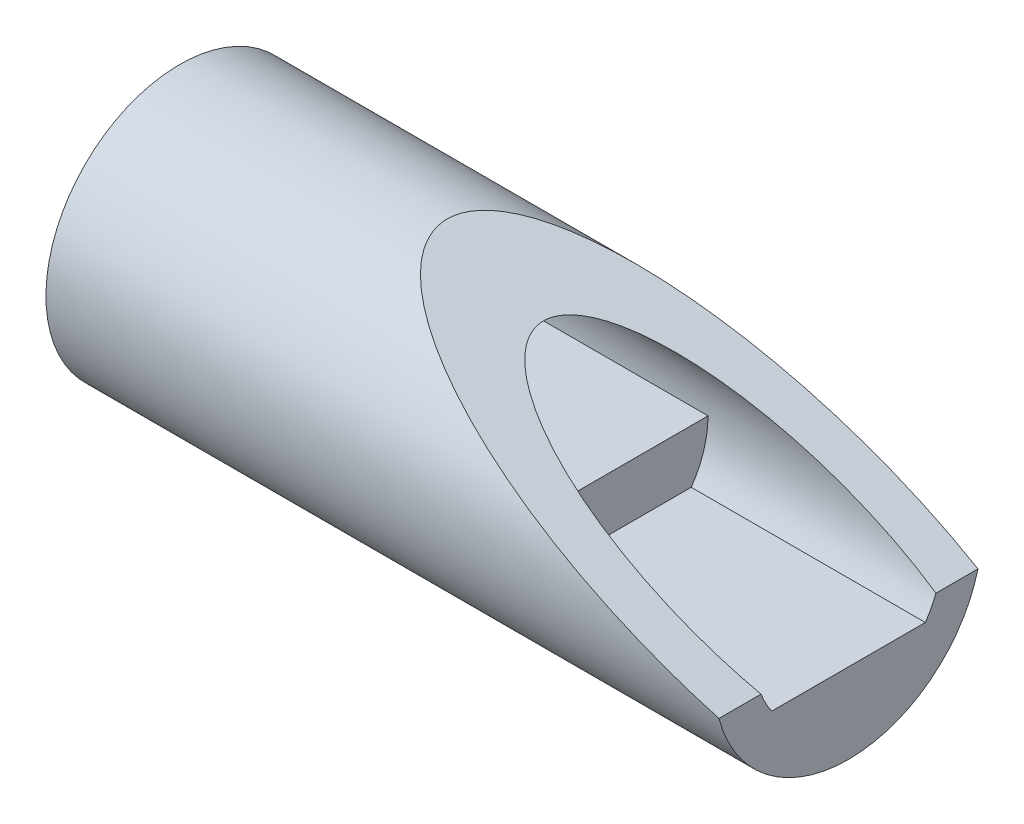
ISO-10303-21;
HEADER;
FILE_DESCRIPTION(('STEP AP214'),'2;1');
FILE_NAME('part.step','',(''),(''),'','','');
FILE_SCHEMA(('AUTOMOTIVE_DESIGN { 1 0 10303 214 1 1 1 1 }'));
ENDSEC;
DATA;
#1=APPLICATION_CONTEXT('core data for automotive mechanical design processes');
#2=APPLICATION_PROTOCOL_DEFINITION('international standard','automotive_design',2000,#1);
#3=PRODUCT_CONTEXT('',#1,'mechanical');
#4=PRODUCT('Part','Part','',(#3));
#5=PRODUCT_RELATED_PRODUCT_CATEGORY('part','',(#4));
#6=PRODUCT_DEFINITION_FORMATION('','',#4);
#7=PRODUCT_DEFINITION_CONTEXT('part definition',#1,'design');
#8=PRODUCT_DEFINITION('design','',#6,#7);
#9=PRODUCT_DEFINITION_SHAPE('','',#8);
#10=(LENGTH_UNIT() NAMED_UNIT(*) SI_UNIT(.MILLI.,.METRE.));
#11=(NAMED_UNIT(*) PLANE_ANGLE_UNIT() SI_UNIT($,.RADIAN.));
#12=(NAMED_UNIT(*) SI_UNIT($,.STERADIAN.) SOLID_ANGLE_UNIT());
#13=UNCERTAINTY_MEASURE_WITH_UNIT(LENGTH_MEASURE(1.E-05),#10,'distance_accuracy_value','');
#14=(GEOMETRIC_REPRESENTATION_CONTEXT(3) GLOBAL_UNCERTAINTY_ASSIGNED_CONTEXT((#13)) GLOBAL_UNIT_ASSIGNED_CONTEXT((#10,
#11,#12)) REPRESENTATION_CONTEXT('',''));
#15=CARTESIAN_POINT('',(0.,0.,0.));
#16=DIRECTION('',(0.,0.,1.));
#17=DIRECTION('',(1.,0.,0.));
#18=AXIS2_PLACEMENT_3D('',#15,#16,#17);
#19=CARTESIAN_POINT('',(100.,0.,0.));
#20=DIRECTION('',(-1.,0.,0.));
#21=DIRECTION('',(0.,0.,1.));
#22=AXIS2_PLACEMENT_3D('',#19,#20,#21);
#23=CYLINDRICAL_SURFACE('',#22,14.);
#24=CARTESIAN_POINT('',(100.,0.,0.));
#25=DIRECTION('',(1.,0.,0.));
#26=DIRECTION('',(0.,0.,-1.));
#27=AXIS2_PLACEMENT_3D('',#24,#25,#26);
#28=CIRCLE('',#27,14.);
#29=CARTESIAN_POINT('',(100.,-8.,-11.4891252930761));
#30=VERTEX_POINT('',#29);
#31=CARTESIAN_POINT('',(100.,-5.,-13.076696830622));
#32=VERTEX_POINT('',#31);
#33=EDGE_CURVE('E108',#30,#32,#28,.T.);
#34=ORIENTED_EDGE('',*,*,#33,.T.);
#35=CARTESIAN_POINT('',(88.,0.,0.));
#36=DIRECTION('',(0.384615384615385,0.923076923076923,0.));
#37=DIRECTION('',(-0.923076923076923,0.384615384615385,0.));
#38=AXIS2_PLACEMENT_3D('',#35,#36,#37);
#39=ELLIPSE('',#38,36.4,14.);
#40=CARTESIAN_POINT('',(100.,-5.,13.076696830622));
#41=VERTEX_POINT('',#40);
#42=EDGE_CURVE('E93',#41,#32,#39,.F.);
#43=ORIENTED_EDGE('',*,*,#42,.F.);
#44=CARTESIAN_POINT('',(100.,-8.,11.4891252930761));
#45=VERTEX_POINT('',#44);
#46=EDGE_CURVE('E113',#41,#45,#28,.T.);
#47=ORIENTED_EDGE('',*,*,#46,.T.);
#48=DIRECTION('',(-1.,0.,0.));
#49=VECTOR('',#48,1.);
#50=CARTESIAN_POINT('',(100.,-8.,11.4891252930761));
#51=LINE('',#50,#49);
#52=CARTESIAN_POINT('',(65.,-8.,11.4891252930761));
#53=VERTEX_POINT('',#52);
#54=EDGE_CURVE('E111',#45,#53,#51,.T.);
#55=ORIENTED_EDGE('',*,*,#54,.T.);
#56=CARTESIAN_POINT('',(65.,0.,0.));
#57=DIRECTION('',(1.,0.,0.));
#58=DIRECTION('',(0.,0.,-1.));
#59=AXIS2_PLACEMENT_3D('',#56,#57,#58);
#60=CIRCLE('',#59,14.);
#61=CARTESIAN_POINT('',(65.,0.,14.));
#62=VERTEX_POINT('',#61);
#63=EDGE_CURVE('E129',#62,#53,#60,.T.);
#64=ORIENTED_EDGE('',*,*,#63,.F.);
#65=DIRECTION('',(-1.,0.,0.));
#66=VECTOR('',#65,1.);
#67=CARTESIAN_POINT('',(65.,0.,14.));
#68=LINE('',#67,#66);
#69=CARTESIAN_POINT('',(0.,0.,14.));
#70=VERTEX_POINT('',#69);
#71=EDGE_CURVE('E11',#62,#70,#68,.T.);
#72=ORIENTED_EDGE('',*,*,#71,.T.);
#73=CARTESIAN_POINT('',(0.,0.,0.));
#74=DIRECTION('',(1.,0.,0.));
#75=DIRECTION('',(0.,0.,-1.));
#76=AXIS2_PLACEMENT_3D('',#73,#74,#75);
#77=CIRCLE('',#76,14.);
#78=CARTESIAN_POINT('',(0.,0.,-14.));
#79=VERTEX_POINT('',#78);
#80=EDGE_CURVE('E117',#79,#70,#77,.T.);
#81=ORIENTED_EDGE('',*,*,#80,.F.);
#82=DIRECTION('',(-1.,0.,0.));
#83=VECTOR('',#82,1.);
#84=CARTESIAN_POINT('',(65.,0.,-14.));
#85=LINE('',#84,#83);
#86=CARTESIAN_POINT('',(65.,0.,-14.));
#87=VERTEX_POINT('',#86);
#88=EDGE_CURVE('E43',#87,#79,#85,.T.);
#89=ORIENTED_EDGE('',*,*,#88,.F.);
#90=CARTESIAN_POINT('',(65.,-8.,-11.4891252930761));
#91=VERTEX_POINT('',#90);
#92=EDGE_CURVE('E59',#91,#87,#60,.T.);
#93=ORIENTED_EDGE('',*,*,#92,.F.);
#94=DIRECTION('',(-1.,0.,0.));
#95=VECTOR('',#94,1.);
#96=CARTESIAN_POINT('',(100.,-8.,-11.4891252930761));
#97=LINE('',#96,#95);
#98=EDGE_CURVE('E107',#30,#91,#97,.T.);
#99=ORIENTED_EDGE('',*,*,#98,.F.);
#100=EDGE_LOOP('',(#34,#43,#47,#55,#64,#72,#81,#89,#93,#99));
#101=FACE_BOUND('',#100,.T.);
#102=ADVANCED_FACE('F35',(#101),#23,.F.);
#103=CARTESIAN_POINT('',(100.,0.,0.));
#104=DIRECTION('',(-1.,0.,0.));
#105=DIRECTION('',(0.,0.,1.));
#106=AXIS2_PLACEMENT_3D('',#103,#104,#105);
#107=CYLINDRICAL_SURFACE('',#106,20.);
#108=CARTESIAN_POINT('',(0.,0.,0.));
#109=DIRECTION('',(1.,0.,0.));
#110=DIRECTION('',(0.,0.,-1.));
#111=AXIS2_PLACEMENT_3D('',#108,#109,#110);
#112=CIRCLE('',#111,20.);
#113=CARTESIAN_POINT('',(0.,0.,-20.));
#114=VERTEX_POINT('',#113);
#115=EDGE_CURVE('E120',#114,#114,#112,.T.);
#116=ORIENTED_EDGE('',*,*,#115,.T.);
#117=EDGE_LOOP('',(#116));
#118=FACE_BOUND('',#117,.T.);
#119=CARTESIAN_POINT('',(88.,0.,0.));
#120=DIRECTION('',(0.384615384615385,0.923076923076923,0.));
#121=DIRECTION('',(-0.923076923076923,0.384615384615385,0.));
#122=AXIS2_PLACEMENT_3D('',#119,#120,#121);
#123=ELLIPSE('',#122,52.,20.);
#124=CARTESIAN_POINT('',(100.,-5.00000000000001,19.3649167310371));
#125=VERTEX_POINT('',#124);
#126=CARTESIAN_POINT('',(100.,-5.00000000000001,-19.3649167310371));
#127=VERTEX_POINT('',#126);
#128=EDGE_CURVE('E50',#125,#127,#123,.F.);
#129=ORIENTED_EDGE('',*,*,#128,.T.);
#130=CARTESIAN_POINT('',(100.,0.,0.));
#131=DIRECTION('',(1.,0.,0.));
#132=DIRECTION('',(0.,0.,-1.));
#133=AXIS2_PLACEMENT_3D('',#130,#131,#132);
#134=CIRCLE('',#133,20.);
#135=EDGE_CURVE('E102',#125,#127,#134,.T.);
#136=ORIENTED_EDGE('',*,*,#135,.F.);
#137=EDGE_LOOP('',(#129,#136));
#138=FACE_BOUND('',#137,.T.);
#139=ADVANCED_FACE('F101',(#118,#138),#107,.T.);
#140=CARTESIAN_POINT('',(100.,0.,0.));
#141=DIRECTION('',(1.,0.,0.));
#142=DIRECTION('',(0.,0.,-1.));
#143=AXIS2_PLACEMENT_3D('',#140,#141,#142);
#144=PLANE('',#143);
#145=ORIENTED_EDGE('',*,*,#135,.T.);
#146=DIRECTION('',(0.,0.,1.));
#147=VECTOR('',#146,1.);
#148=CARTESIAN_POINT('',(100.,-5.,-20.001));
#149=LINE('',#148,#147);
#150=EDGE_CURVE('E90',#127,#32,#149,.T.);
#151=ORIENTED_EDGE('',*,*,#150,.T.);
#152=ORIENTED_EDGE('',*,*,#33,.F.);
#153=DIRECTION('',(0.,0.,-1.));
#154=VECTOR('',#153,1.);
#155=CARTESIAN_POINT('',(100.,-8.,0.));
#156=LINE('',#155,#154);
#157=EDGE_CURVE('E122',#45,#30,#156,.T.);
#158=ORIENTED_EDGE('',*,*,#157,.F.);
#159=ORIENTED_EDGE('',*,*,#46,.F.);
#160=DIRECTION('',(0.,0.,-1.));
#161=VECTOR('',#160,1.);
#162=CARTESIAN_POINT('',(100.,-5.,20.001));
#163=LINE('',#162,#161);
#164=EDGE_CURVE('E106',#125,#41,#163,.T.);
#165=ORIENTED_EDGE('',*,*,#164,.F.);
#166=EDGE_LOOP('',(#145,#151,#152,#158,#159,#165));
#167=FACE_BOUND('',#166,.T.);
#168=ADVANCED_FACE('F104',(#167),#144,.T.);
#169=CARTESIAN_POINT('',(65.,0.,0.));
#170=DIRECTION('',(0.,1.,0.));
#171=DIRECTION('',(0.,0.,1.));
#172=AXIS2_PLACEMENT_3D('',#169,#170,#171);
#173=PLANE('',#172);
#174=DIRECTION('',(0.,0.,-1.));
#175=VECTOR('',#174,1.);
#176=CARTESIAN_POINT('',(0.,0.,0.));
#177=LINE('',#176,#175);
#178=EDGE_CURVE('E126',#70,#79,#177,.T.);
#179=ORIENTED_EDGE('',*,*,#178,.F.);
#180=ORIENTED_EDGE('',*,*,#71,.F.);
#181=DIRECTION('',(0.,0.,-1.));
#182=VECTOR('',#181,1.);
#183=CARTESIAN_POINT('',(65.,0.,0.));
#184=LINE('',#183,#182);
#185=EDGE_CURVE('E127',#62,#87,#184,.T.);
#186=ORIENTED_EDGE('',*,*,#185,.T.);
#187=ORIENTED_EDGE('',*,*,#88,.T.);
#188=EDGE_LOOP('',(#179,#180,#186,#187));
#189=FACE_BOUND('',#188,.T.);
#190=ADVANCED_FACE('F37',(#189),#173,.T.);
#191=CARTESIAN_POINT('',(65.,0.,0.));
#192=DIRECTION('',(1.,0.,0.));
#193=DIRECTION('',(0.,0.,-1.));
#194=AXIS2_PLACEMENT_3D('',#191,#192,#193);
#195=PLANE('',#194);
#196=ORIENTED_EDGE('',*,*,#185,.F.);
#197=ORIENTED_EDGE('',*,*,#63,.T.);
#198=DIRECTION('',(0.,0.,-1.));
#199=VECTOR('',#198,1.);
#200=CARTESIAN_POINT('',(65.,-8.,0.));
#201=LINE('',#200,#199);
#202=EDGE_CURVE('E131',#53,#91,#201,.T.);
#203=ORIENTED_EDGE('',*,*,#202,.T.);
#204=ORIENTED_EDGE('',*,*,#92,.T.);
#205=EDGE_LOOP('',(#196,#197,#203,#204));
#206=FACE_BOUND('',#205,.T.);
#207=ADVANCED_FACE('F141',(#206),#195,.T.);
#208=CARTESIAN_POINT('',(0.,0.,0.));
#209=DIRECTION('',(1.,0.,0.));
#210=DIRECTION('',(0.,0.,-1.));
#211=AXIS2_PLACEMENT_3D('',#208,#209,#210);
#212=PLANE('',#211);
#213=ORIENTED_EDGE('',*,*,#178,.T.);
#214=ORIENTED_EDGE('',*,*,#80,.T.);
#215=EDGE_LOOP('',(#213,#214));
#216=FACE_BOUND('',#215,.T.);
#217=ORIENTED_EDGE('',*,*,#115,.F.);
#218=EDGE_LOOP('',(#217));
#219=FACE_BOUND('',#218,.T.);
#220=ADVANCED_FACE('F135',(#216,#219),#212,.F.);
#221=CARTESIAN_POINT('',(100.,-8.,0.));
#222=DIRECTION('',(0.,1.,0.));
#223=DIRECTION('',(0.,0.,1.));
#224=AXIS2_PLACEMENT_3D('',#221,#222,#223);
#225=PLANE('',#224);
#226=ORIENTED_EDGE('',*,*,#98,.T.);
#227=ORIENTED_EDGE('',*,*,#202,.F.);
#228=ORIENTED_EDGE('',*,*,#54,.F.);
#229=ORIENTED_EDGE('',*,*,#157,.T.);
#230=EDGE_LOOP('',(#226,#227,#228,#229));
#231=FACE_BOUND('',#230,.T.);
#232=ADVANCED_FACE('F143',(#231),#225,.T.);
#233=CARTESIAN_POINT('',(40.,20.,20.001));
#234=DIRECTION('',(0.384615384615385,0.923076923076923,0.));
#235=DIRECTION('',(-0.923076923076923,0.384615384615385,0.));
#236=AXIS2_PLACEMENT_3D('',#233,#234,#235);
#237=PLANE('',#236);
#238=ORIENTED_EDGE('',*,*,#42,.T.);
#239=ORIENTED_EDGE('',*,*,#150,.F.);
#240=ORIENTED_EDGE('',*,*,#128,.F.);
#241=ORIENTED_EDGE('',*,*,#164,.T.);
#242=EDGE_LOOP('',(#238,#239,#240,#241));
#243=FACE_BOUND('',#242,.T.);
#244=ADVANCED_FACE('F91',(#243),#237,.T.);
#245=CLOSED_SHELL('',(#102,#139,#168,#190,#207,#220,#232,#244));
#246=MANIFOLD_SOLID_BREP('B2',#245);
#247=ADVANCED_BREP_SHAPE_REPRESENTATION('',(#18,#246),#14);
#248=SHAPE_DEFINITION_REPRESENTATION(#9,#247);
ENDSEC;
END-ISO-10303-21;
